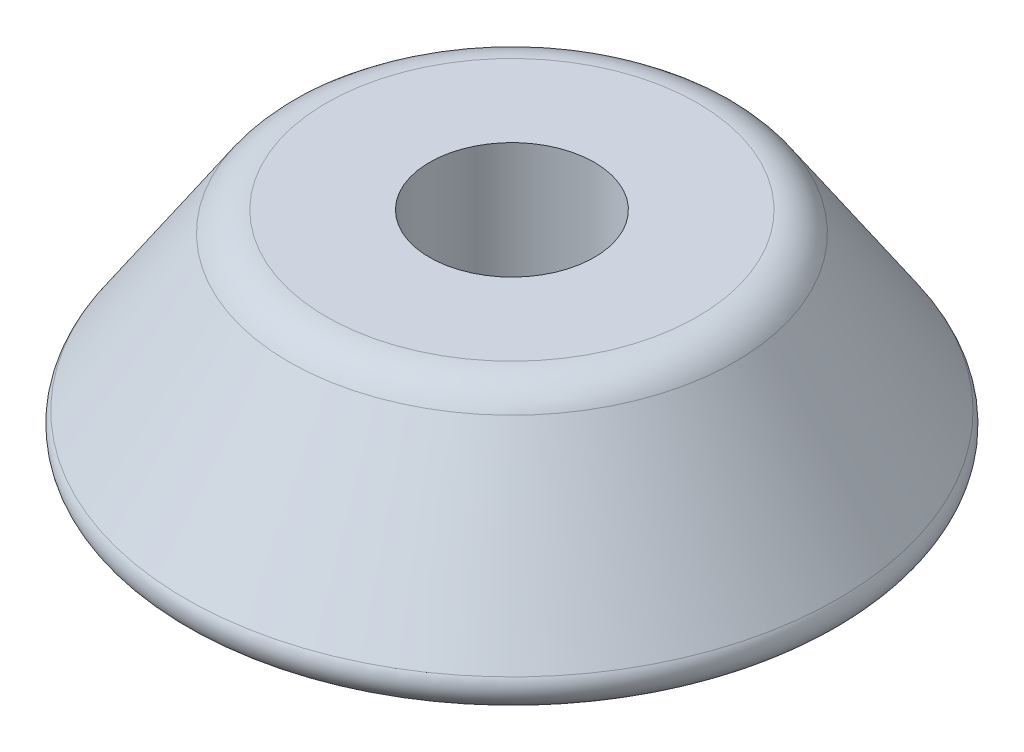
ISO-10303-21;
HEADER;
FILE_DESCRIPTION(('STEP AP214'),'2;1');
FILE_NAME('part.step','',(''),(''),'','','');
FILE_SCHEMA(('AUTOMOTIVE_DESIGN { 1 0 10303 214 1 1 1 1 }'));
ENDSEC;
DATA;
#1=APPLICATION_CONTEXT('core data for automotive mechanical design processes');
#2=APPLICATION_PROTOCOL_DEFINITION('international standard','automotive_design',2000,#1);
#3=PRODUCT_CONTEXT('',#1,'mechanical');
#4=PRODUCT('Part','Part','',(#3));
#5=PRODUCT_RELATED_PRODUCT_CATEGORY('part','',(#4));
#6=PRODUCT_DEFINITION_FORMATION('','',#4);
#7=PRODUCT_DEFINITION_CONTEXT('part definition',#1,'design');
#8=PRODUCT_DEFINITION('design','',#6,#7);
#9=PRODUCT_DEFINITION_SHAPE('','',#8);
#10=(LENGTH_UNIT() NAMED_UNIT(*) SI_UNIT(.MILLI.,.METRE.));
#11=(NAMED_UNIT(*) PLANE_ANGLE_UNIT() SI_UNIT($,.RADIAN.));
#12=(NAMED_UNIT(*) SI_UNIT($,.STERADIAN.) SOLID_ANGLE_UNIT());
#13=UNCERTAINTY_MEASURE_WITH_UNIT(LENGTH_MEASURE(1.E-05),#10,'distance_accuracy_value','');
#14=(GEOMETRIC_REPRESENTATION_CONTEXT(3) GLOBAL_UNCERTAINTY_ASSIGNED_CONTEXT((#13)) GLOBAL_UNIT_ASSIGNED_CONTEXT((#10,
#11,#12)) REPRESENTATION_CONTEXT('',''));
#15=CARTESIAN_POINT('',(0.,0.,0.));
#16=DIRECTION('',(0.,0.,1.));
#17=DIRECTION('',(1.,0.,0.));
#18=AXIS2_PLACEMENT_3D('',#15,#16,#17);
#19=CARTESIAN_POINT('',(15.,0.,0.));
#20=DIRECTION('',(0.,-1.,0.));
#21=DIRECTION('',(0.,0.,-1.));
#22=AXIS2_PLACEMENT_3D('',#19,#20,#21);
#23=PLANE('',#22);
#24=CARTESIAN_POINT('',(0.,0.,0.));
#25=DIRECTION('',(0.,-1.,0.));
#26=DIRECTION('',(0.,0.,-1.));
#27=AXIS2_PLACEMENT_3D('',#24,#25,#26);
#28=CIRCLE('',#27,15.);
#29=CARTESIAN_POINT('',(0.,0.,-15.));
#30=VERTEX_POINT('',#29);
#31=EDGE_CURVE('E55',#30,#30,#28,.T.);
#32=ORIENTED_EDGE('',*,*,#31,.T.);
#33=EDGE_LOOP('',(#32));
#34=FACE_BOUND('',#33,.T.);
#35=CARTESIAN_POINT('',(0.,0.,0.));
#36=DIRECTION('',(0.,-1.,0.));
#37=DIRECTION('',(0.,0.,-1.));
#38=AXIS2_PLACEMENT_3D('',#35,#36,#37);
#39=CIRCLE('',#38,4.);
#40=CARTESIAN_POINT('',(0.,0.,-4.));
#41=VERTEX_POINT('',#40);
#42=EDGE_CURVE('E10',#41,#41,#39,.T.);
#43=ORIENTED_EDGE('',*,*,#42,.F.);
#44=EDGE_LOOP('',(#43));
#45=FACE_BOUND('',#44,.T.);
#46=ADVANCED_FACE('F33',(#34,#45),#23,.T.);
#47=CARTESIAN_POINT('',(0.,0.,0.));
#48=DIRECTION('',(0.,-1.,0.));
#49=DIRECTION('',(0.,0.,-1.));
#50=AXIS2_PLACEMENT_3D('',#47,#48,#49);
#51=CYLINDRICAL_SURFACE('',#50,4.);
#52=ORIENTED_EDGE('',*,*,#42,.T.);
#53=EDGE_LOOP('',(#52));
#54=FACE_BOUND('',#53,.T.);
#55=CARTESIAN_POINT('',(0.,10.,0.));
#56=DIRECTION('',(0.,-1.,0.));
#57=DIRECTION('',(0.,0.,-1.));
#58=AXIS2_PLACEMENT_3D('',#55,#56,#57);
#59=CIRCLE('',#58,4.);
#60=CARTESIAN_POINT('',(0.,10.,-4.));
#61=VERTEX_POINT('',#60);
#62=EDGE_CURVE('E39',#61,#61,#59,.T.);
#63=ORIENTED_EDGE('',*,*,#62,.F.);
#64=EDGE_LOOP('',(#63));
#65=FACE_BOUND('',#64,.T.);
#66=ADVANCED_FACE('F73',(#54,#65),#51,.F.);
#67=CARTESIAN_POINT('',(4.,10.,0.));
#68=DIRECTION('',(0.,1.,0.));
#69=DIRECTION('',(0.,0.,1.));
#70=AXIS2_PLACEMENT_3D('',#67,#68,#69);
#71=PLANE('',#70);
#72=ORIENTED_EDGE('',*,*,#62,.T.);
#73=EDGE_LOOP('',(#72));
#74=FACE_BOUND('',#73,.T.);
#75=CARTESIAN_POINT('',(0.,10.,0.));
#76=DIRECTION('',(0.,-1.,0.));
#77=DIRECTION('',(0.,0.,-1.));
#78=AXIS2_PLACEMENT_3D('',#75,#76,#77);
#79=CIRCLE('',#78,9.);
#80=CARTESIAN_POINT('',(0.,10.,-9.));
#81=VERTEX_POINT('',#80);
#82=EDGE_CURVE('E43',#81,#81,#79,.T.);
#83=ORIENTED_EDGE('',*,*,#82,.F.);
#84=EDGE_LOOP('',(#83));
#85=FACE_BOUND('',#84,.T.);
#86=ADVANCED_FACE('F77',(#74,#85),#71,.T.);
#87=CARTESIAN_POINT('',(0.,7.79657920417591,0.));
#88=DIRECTION('',(0.,-1.,0.));
#89=DIRECTION('',(0.,0.,-1.));
#90=AXIS2_PLACEMENT_3D('',#87,#88,#89);
#91=TOROIDAL_SURFACE('',#90,9.,2.20342079582409);
#92=ORIENTED_EDGE('',*,*,#82,.T.);
#93=EDGE_LOOP('',(#92));
#94=FACE_BOUND('',#93,.T.);
#95=CARTESIAN_POINT('',(0.,9.02265422434769,0.));
#96=DIRECTION('',(0.,-1.,0.));
#97=DIRECTION('',(0.,0.,-1.));
#98=AXIS2_PLACEMENT_3D('',#95,#96,#97);
#99=CIRCLE('',#98,10.8307930654175);
#100=CARTESIAN_POINT('',(0.,9.02265422434769,-10.8307930654175));
#101=VERTEX_POINT('',#100);
#102=EDGE_CURVE('E47',#101,#101,#99,.T.);
#103=ORIENTED_EDGE('',*,*,#102,.F.);
#104=EDGE_LOOP('',(#103));
#105=FACE_BOUND('',#104,.T.);
#106=ADVANCED_FACE('F69',(#94,#105),#91,.T.);
#107=CARTESIAN_POINT('',(0.,1.55644161228551,0.));
#108=DIRECTION('',(0.,-1.,0.));
#109=DIRECTION('',(0.,0.,-1.));
#110=AXIS2_PLACEMENT_3D('',#107,#108,#109);
#111=CONICAL_SURFACE('',#110,15.8308867143703,0.590096988860552);
#112=ORIENTED_EDGE('',*,*,#102,.T.);
#113=EDGE_LOOP('',(#112));
#114=FACE_BOUND('',#113,.T.);
#115=CARTESIAN_POINT('',(0.,1.55644161228551,0.));
#116=DIRECTION('',(0.,-1.,0.));
#117=DIRECTION('',(0.,0.,-1.));
#118=AXIS2_PLACEMENT_3D('',#115,#116,#117);
#119=CIRCLE('',#118,15.8308867143703);
#120=CARTESIAN_POINT('',(0.,1.55644161228551,-15.8308867143703));
#121=VERTEX_POINT('',#120);
#122=EDGE_CURVE('E52',#121,#121,#119,.T.);
#123=ORIENTED_EDGE('',*,*,#122,.F.);
#124=EDGE_LOOP('',(#123));
#125=FACE_BOUND('',#124,.T.);
#126=ADVANCED_FACE('F63',(#114,#125),#111,.T.);
#127=CARTESIAN_POINT('',(0.,1.,0.));
#128=DIRECTION('',(0.,-1.,0.));
#129=DIRECTION('',(0.,0.,-1.));
#130=AXIS2_PLACEMENT_3D('',#127,#128,#129);
#131=TOROIDAL_SURFACE('',#130,15.,1.);
#132=ORIENTED_EDGE('',*,*,#122,.T.);
#133=EDGE_LOOP('',(#132));
#134=FACE_BOUND('',#133,.T.);
#135=ORIENTED_EDGE('',*,*,#31,.F.);
#136=EDGE_LOOP('',(#135));
#137=FACE_BOUND('',#136,.T.);
#138=ADVANCED_FACE('F61',(#134,#137),#131,.T.);
#139=CLOSED_SHELL('',(#46,#66,#86,#106,#126,#138));
#140=MANIFOLD_SOLID_BREP('B2',#139);
#141=ADVANCED_BREP_SHAPE_REPRESENTATION('',(#18,#140),#14);
#142=SHAPE_DEFINITION_REPRESENTATION(#9,#141);
ENDSEC;
END-ISO-10303-21;
